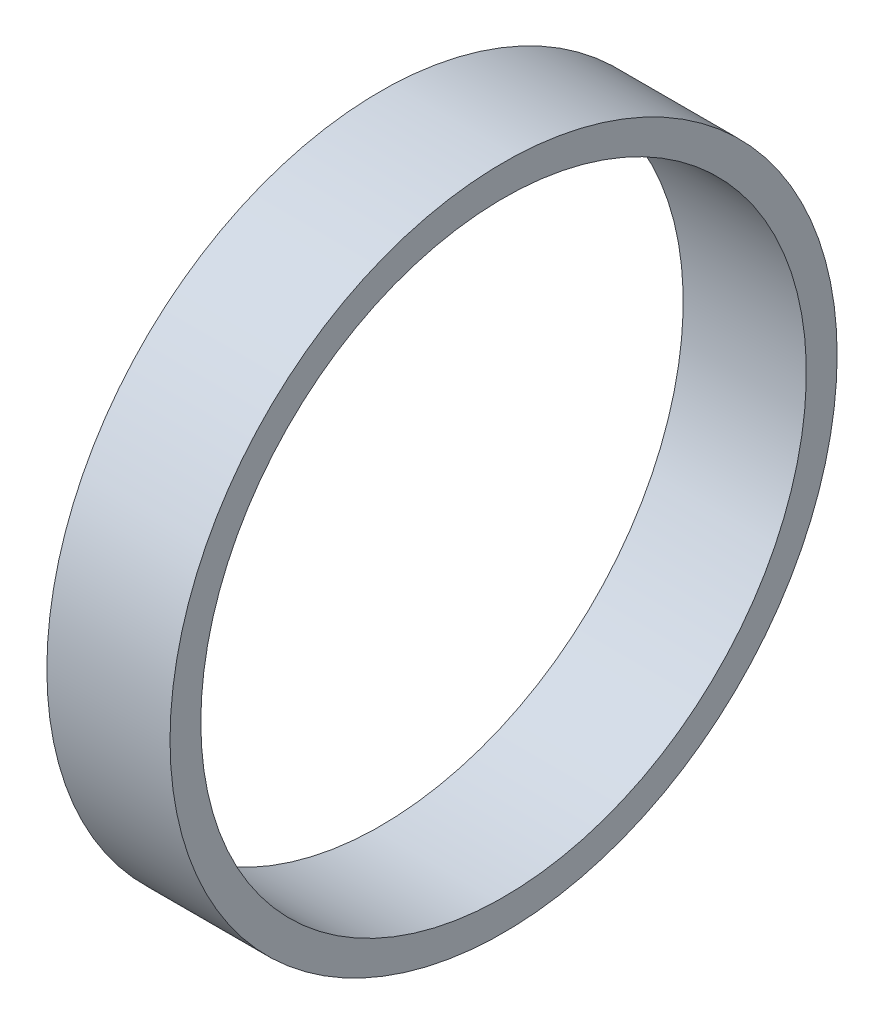
ISO-10303-21;
HEADER;
FILE_DESCRIPTION(('STEP AP214'),'2;1');
FILE_NAME('part.step','',(''),(''),'','','');
FILE_SCHEMA(('AUTOMOTIVE_DESIGN { 1 0 10303 214 1 1 1 1 }'));
ENDSEC;
DATA;
#1=APPLICATION_CONTEXT('core data for automotive mechanical design processes');
#2=APPLICATION_PROTOCOL_DEFINITION('international standard','automotive_design',2000,#1);
#3=PRODUCT_CONTEXT('',#1,'mechanical');
#4=PRODUCT('Part','Part','',(#3));
#5=PRODUCT_RELATED_PRODUCT_CATEGORY('part','',(#4));
#6=PRODUCT_DEFINITION_FORMATION('','',#4);
#7=PRODUCT_DEFINITION_CONTEXT('part definition',#1,'design');
#8=PRODUCT_DEFINITION('design','',#6,#7);
#9=PRODUCT_DEFINITION_SHAPE('','',#8);
#10=(LENGTH_UNIT() NAMED_UNIT(*) SI_UNIT(.MILLI.,.METRE.));
#11=(NAMED_UNIT(*) PLANE_ANGLE_UNIT() SI_UNIT($,.RADIAN.));
#12=(NAMED_UNIT(*) SI_UNIT($,.STERADIAN.) SOLID_ANGLE_UNIT());
#13=UNCERTAINTY_MEASURE_WITH_UNIT(LENGTH_MEASURE(1.E-05),#10,'distance_accuracy_value','');
#14=(GEOMETRIC_REPRESENTATION_CONTEXT(3) GLOBAL_UNCERTAINTY_ASSIGNED_CONTEXT((#13)) GLOBAL_UNIT_ASSIGNED_CONTEXT((#10,
#11,#12)) REPRESENTATION_CONTEXT('',''));
#15=CARTESIAN_POINT('',(0.,0.,0.));
#16=DIRECTION('',(0.,0.,1.));
#17=DIRECTION('',(1.,0.,0.));
#18=AXIS2_PLACEMENT_3D('',#15,#16,#17);
#19=CARTESIAN_POINT('',(-1.9,13.,0.));
#20=DIRECTION('',(1.,0.,0.));
#21=DIRECTION('',(0.,0.,-1.));
#22=AXIS2_PLACEMENT_3D('',#19,#20,#21);
#23=PLANE('',#22);
#24=CARTESIAN_POINT('',(-1.9,0.,0.));
#25=DIRECTION('',(-1.,0.,0.));
#26=DIRECTION('',(0.,0.,1.));
#27=AXIS2_PLACEMENT_3D('',#24,#25,#26);
#28=CIRCLE('',#27,11.8);
#29=CARTESIAN_POINT('',(-1.9,0.,11.8));
#30=VERTEX_POINT('',#29);
#31=EDGE_CURVE('E10',#30,#30,#28,.T.);
#32=ORIENTED_EDGE('',*,*,#31,.F.);
#33=EDGE_LOOP('',(#32));
#34=FACE_BOUND('',#33,.T.);
#35=CARTESIAN_POINT('',(-1.9,0.,0.));
#36=DIRECTION('',(-1.,0.,0.));
#37=DIRECTION('',(0.,0.,1.));
#38=AXIS2_PLACEMENT_3D('',#35,#36,#37);
#39=CIRCLE('',#38,13.);
#40=CARTESIAN_POINT('',(-1.9,0.,13.));
#41=VERTEX_POINT('',#40);
#42=EDGE_CURVE('E54',#41,#41,#39,.T.);
#43=ORIENTED_EDGE('',*,*,#42,.T.);
#44=EDGE_LOOP('',(#43));
#45=FACE_BOUND('',#44,.T.);
#46=ADVANCED_FACE('F37',(#34,#45),#23,.F.);
#47=CARTESIAN_POINT('',(-110.,0.,0.));
#48=DIRECTION('',(-1.,0.,0.));
#49=DIRECTION('',(0.,0.,1.));
#50=AXIS2_PLACEMENT_3D('',#47,#48,#49);
#51=CYLINDRICAL_SURFACE('',#50,11.8);
#52=CARTESIAN_POINT('',(2.9,0.,0.));
#53=DIRECTION('',(-1.,0.,0.));
#54=DIRECTION('',(0.,0.,1.));
#55=AXIS2_PLACEMENT_3D('',#52,#53,#54);
#56=CIRCLE('',#55,11.8);
#57=CARTESIAN_POINT('',(2.9,0.,11.8));
#58=VERTEX_POINT('',#57);
#59=EDGE_CURVE('E44',#58,#58,#56,.T.);
#60=ORIENTED_EDGE('',*,*,#59,.F.);
#61=EDGE_LOOP('',(#60));
#62=FACE_BOUND('',#61,.T.);
#63=ORIENTED_EDGE('',*,*,#31,.T.);
#64=EDGE_LOOP('',(#63));
#65=FACE_BOUND('',#64,.T.);
#66=ADVANCED_FACE('F70',(#62,#65),#51,.F.);
#67=CARTESIAN_POINT('',(2.9,11.8,0.));
#68=DIRECTION('',(-1.,0.,0.));
#69=DIRECTION('',(0.,0.,1.));
#70=AXIS2_PLACEMENT_3D('',#67,#68,#69);
#71=PLANE('',#70);
#72=CARTESIAN_POINT('',(2.9,0.,0.));
#73=DIRECTION('',(-1.,0.,0.));
#74=DIRECTION('',(0.,0.,1.));
#75=AXIS2_PLACEMENT_3D('',#72,#73,#74);
#76=CIRCLE('',#75,13.);
#77=CARTESIAN_POINT('',(2.9,0.,13.));
#78=VERTEX_POINT('',#77);
#79=EDGE_CURVE('E49',#78,#78,#76,.T.);
#80=ORIENTED_EDGE('',*,*,#79,.F.);
#81=EDGE_LOOP('',(#80));
#82=FACE_BOUND('',#81,.T.);
#83=ORIENTED_EDGE('',*,*,#59,.T.);
#84=EDGE_LOOP('',(#83));
#85=FACE_BOUND('',#84,.T.);
#86=ADVANCED_FACE('F65',(#82,#85),#71,.F.);
#87=CARTESIAN_POINT('',(-110.,0.,0.));
#88=DIRECTION('',(-1.,0.,0.));
#89=DIRECTION('',(0.,0.,1.));
#90=AXIS2_PLACEMENT_3D('',#87,#88,#89);
#91=CYLINDRICAL_SURFACE('',#90,13.);
#92=ORIENTED_EDGE('',*,*,#42,.F.);
#93=EDGE_LOOP('',(#92));
#94=FACE_BOUND('',#93,.T.);
#95=ORIENTED_EDGE('',*,*,#79,.T.);
#96=EDGE_LOOP('',(#95));
#97=FACE_BOUND('',#96,.T.);
#98=ADVANCED_FACE('F62',(#94,#97),#91,.T.);
#99=CLOSED_SHELL('',(#46,#66,#86,#98));
#100=MANIFOLD_SOLID_BREP('B2',#99);
#101=ADVANCED_BREP_SHAPE_REPRESENTATION('',(#18,#100),#14);
#102=SHAPE_DEFINITION_REPRESENTATION(#9,#101);
ENDSEC;
END-ISO-10303-21;
